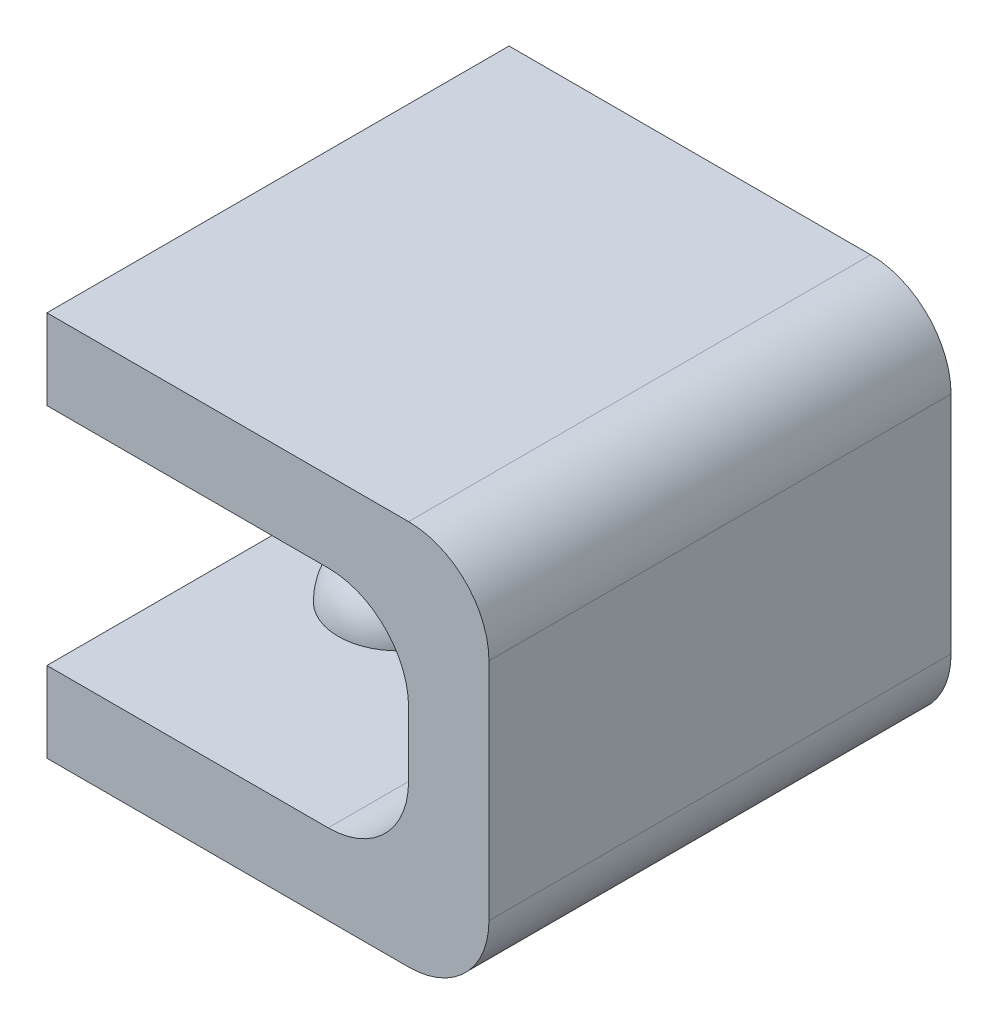
ISO-10303-21;
HEADER;
FILE_DESCRIPTION(('STEP AP214'),'2;1');
FILE_NAME('part.step','',(''),(''),'','','');
FILE_SCHEMA(('AUTOMOTIVE_DESIGN { 1 0 10303 214 1 1 1 1 }'));
ENDSEC;
DATA;
#1=APPLICATION_CONTEXT('core data for automotive mechanical design processes');
#2=APPLICATION_PROTOCOL_DEFINITION('international standard','automotive_design',2000,#1);
#3=PRODUCT_CONTEXT('',#1,'mechanical');
#4=PRODUCT('Part','Part','',(#3));
#5=PRODUCT_RELATED_PRODUCT_CATEGORY('part','',(#4));
#6=PRODUCT_DEFINITION_FORMATION('','',#4);
#7=PRODUCT_DEFINITION_CONTEXT('part definition',#1,'design');
#8=PRODUCT_DEFINITION('design','',#6,#7);
#9=PRODUCT_DEFINITION_SHAPE('','',#8);
#10=(LENGTH_UNIT() NAMED_UNIT(*) SI_UNIT(.MILLI.,.METRE.));
#11=(NAMED_UNIT(*) PLANE_ANGLE_UNIT() SI_UNIT($,.RADIAN.));
#12=(NAMED_UNIT(*) SI_UNIT($,.STERADIAN.) SOLID_ANGLE_UNIT());
#13=UNCERTAINTY_MEASURE_WITH_UNIT(LENGTH_MEASURE(1.E-05),#10,'distance_accuracy_value','');
#14=(GEOMETRIC_REPRESENTATION_CONTEXT(3) GLOBAL_UNCERTAINTY_ASSIGNED_CONTEXT((#13)) GLOBAL_UNIT_ASSIGNED_CONTEXT((#10,
#11,#12)) REPRESENTATION_CONTEXT('',''));
#15=CARTESIAN_POINT('',(0.,0.,0.));
#16=DIRECTION('',(0.,0.,1.));
#17=DIRECTION('',(1.,0.,0.));
#18=AXIS2_PLACEMENT_3D('',#15,#16,#17);
#19=CARTESIAN_POINT('',(-9.,4.8,11.5));
#20=DIRECTION('',(1.,0.,0.));
#21=DIRECTION('',(0.,0.,-1.));
#22=AXIS2_PLACEMENT_3D('',#19,#20,#21);
#23=PLANE('',#22);
#24=DIRECTION('',(0.,-1.,0.));
#25=VECTOR('',#24,1.);
#26=CARTESIAN_POINT('',(-9.,4.8,0.));
#27=LINE('',#26,#25);
#28=CARTESIAN_POINT('',(-9.,4.8,0.));
#29=VERTEX_POINT('',#28);
#30=CARTESIAN_POINT('',(-9.,2.8,0.));
#31=VERTEX_POINT('',#30);
#32=EDGE_CURVE('E147',#29,#31,#27,.T.);
#33=ORIENTED_EDGE('',*,*,#32,.T.);
#34=DIRECTION('',(0.,0.,-1.));
#35=VECTOR('',#34,1.);
#36=CARTESIAN_POINT('',(-9.,2.8,11.5));
#37=LINE('',#36,#35);
#38=CARTESIAN_POINT('',(-9.,2.8,11.5));
#39=VERTEX_POINT('',#38);
#40=EDGE_CURVE('E128',#39,#31,#37,.T.);
#41=ORIENTED_EDGE('',*,*,#40,.F.);
#42=DIRECTION('',(0.,-1.,0.));
#43=VECTOR('',#42,1.);
#44=CARTESIAN_POINT('',(-9.,4.8,11.5));
#45=LINE('',#44,#43);
#46=CARTESIAN_POINT('',(-9.,4.8,11.5));
#47=VERTEX_POINT('',#46);
#48=EDGE_CURVE('E134',#47,#39,#45,.T.);
#49=ORIENTED_EDGE('',*,*,#48,.F.);
#50=DIRECTION('',(0.,0.,-1.));
#51=VECTOR('',#50,1.);
#52=CARTESIAN_POINT('',(-9.,4.8,11.5));
#53=LINE('',#52,#51);
#54=EDGE_CURVE('E223',#47,#29,#53,.T.);
#55=ORIENTED_EDGE('',*,*,#54,.T.);
#56=EDGE_LOOP('',(#33,#41,#49,#55));
#57=FACE_BOUND('',#56,.T.);
#58=ADVANCED_FACE('F33',(#57),#23,.F.);
#59=CARTESIAN_POINT('',(-9.,2.8,11.5));
#60=DIRECTION('',(0.,1.,0.));
#61=DIRECTION('',(-1.,0.,0.));
#62=AXIS2_PLACEMENT_3D('',#59,#60,#61);
#63=PLANE('',#62);
#64=CARTESIAN_POINT('',(-6.,2.8,5.75));
#65=DIRECTION('',(0.,1.,0.));
#66=DIRECTION('',(-1.,0.,0.));
#67=AXIS2_PLACEMENT_3D('',#64,#65,#66);
#68=CIRCLE('',#67,1.5);
#69=CARTESIAN_POINT('',(-7.5,2.8,5.75));
#70=VERTEX_POINT('',#69);
#71=EDGE_CURVE('E148',#70,#70,#68,.F.);
#72=ORIENTED_EDGE('',*,*,#71,.F.);
#73=EDGE_LOOP('',(#72));
#74=FACE_BOUND('',#73,.T.);
#75=DIRECTION('',(1.,0.,0.));
#76=VECTOR('',#75,1.);
#77=CARTESIAN_POINT('',(-9.,2.8,0.));
#78=LINE('',#77,#76);
#79=CARTESIAN_POINT('',(-2.,2.8,0.));
#80=VERTEX_POINT('',#79);
#81=EDGE_CURVE('E206',#31,#80,#78,.T.);
#82=ORIENTED_EDGE('',*,*,#81,.T.);
#83=DIRECTION('',(0.,0.,-1.));
#84=VECTOR('',#83,1.);
#85=CARTESIAN_POINT('',(-2.,2.8,11.5));
#86=LINE('',#85,#84);
#87=CARTESIAN_POINT('',(-2.,2.8,11.5));
#88=VERTEX_POINT('',#87);
#89=EDGE_CURVE('E131',#80,#88,#86,.F.);
#90=ORIENTED_EDGE('',*,*,#89,.T.);
#91=DIRECTION('',(1.,0.,0.));
#92=VECTOR('',#91,1.);
#93=CARTESIAN_POINT('',(-9.,2.8,11.5));
#94=LINE('',#93,#92);
#95=EDGE_CURVE('E123',#39,#88,#94,.T.);
#96=ORIENTED_EDGE('',*,*,#95,.F.);
#97=ORIENTED_EDGE('',*,*,#40,.T.);
#98=EDGE_LOOP('',(#82,#90,#96,#97));
#99=FACE_BOUND('',#98,.T.);
#100=ADVANCED_FACE('F126',(#74,#99),#63,.F.);
#101=CARTESIAN_POINT('',(0.,2.8,11.5));
#102=DIRECTION('',(1.,0.,0.));
#103=DIRECTION('',(0.,0.,-1.));
#104=AXIS2_PLACEMENT_3D('',#101,#102,#103);
#105=PLANE('',#104);
#106=DIRECTION('',(0.,-1.,0.));
#107=VECTOR('',#106,1.);
#108=CARTESIAN_POINT('',(0.,2.8,11.5));
#109=LINE('',#108,#107);
#110=CARTESIAN_POINT('',(0.,0.8,11.5));
#111=VERTEX_POINT('',#110);
#112=CARTESIAN_POINT('',(0.,-0.8,11.5));
#113=VERTEX_POINT('',#112);
#114=EDGE_CURVE('E133',#111,#113,#109,.T.);
#115=ORIENTED_EDGE('',*,*,#114,.F.);
#116=DIRECTION('',(0.,0.,-1.));
#117=VECTOR('',#116,1.);
#118=CARTESIAN_POINT('',(0.,0.8,0.));
#119=LINE('',#118,#117);
#120=CARTESIAN_POINT('',(0.,0.8,0.));
#121=VERTEX_POINT('',#120);
#122=EDGE_CURVE('E180',#111,#121,#119,.T.);
#123=ORIENTED_EDGE('',*,*,#122,.T.);
#124=DIRECTION('',(0.,-1.,0.));
#125=VECTOR('',#124,1.);
#126=CARTESIAN_POINT('',(0.,2.8,0.));
#127=LINE('',#126,#125);
#128=CARTESIAN_POINT('',(0.,-0.8,0.));
#129=VERTEX_POINT('',#128);
#130=EDGE_CURVE('E196',#121,#129,#127,.T.);
#131=ORIENTED_EDGE('',*,*,#130,.T.);
#132=DIRECTION('',(0.,0.,-1.));
#133=VECTOR('',#132,1.);
#134=CARTESIAN_POINT('',(0.,-0.800000000000001,11.5));
#135=LINE('',#134,#133);
#136=EDGE_CURVE('E178',#129,#113,#135,.F.);
#137=ORIENTED_EDGE('',*,*,#136,.T.);
#138=EDGE_LOOP('',(#115,#123,#131,#137));
#139=FACE_BOUND('',#138,.T.);
#140=ADVANCED_FACE('F204',(#139),#105,.F.);
#141=CARTESIAN_POINT('',(0.,-2.8,11.5));
#142=DIRECTION('',(0.,-1.,0.));
#143=DIRECTION('',(1.,0.,0.));
#144=AXIS2_PLACEMENT_3D('',#141,#142,#143);
#145=PLANE('',#144);
#146=CARTESIAN_POINT('',(-6.,-2.8,5.75));
#147=DIRECTION('',(0.,-1.,0.));
#148=DIRECTION('',(1.,0.,0.));
#149=AXIS2_PLACEMENT_3D('',#146,#147,#148);
#150=CIRCLE('',#149,1.5);
#151=CARTESIAN_POINT('',(-4.5,-2.8,5.75));
#152=VERTEX_POINT('',#151);
#153=EDGE_CURVE('E152',#152,#152,#150,.F.);
#154=ORIENTED_EDGE('',*,*,#153,.F.);
#155=EDGE_LOOP('',(#154));
#156=FACE_BOUND('',#155,.T.);
#157=DIRECTION('',(-1.,0.,0.));
#158=VECTOR('',#157,1.);
#159=CARTESIAN_POINT('',(0.,-2.8,11.5));
#160=LINE('',#159,#158);
#161=CARTESIAN_POINT('',(-2.,-2.8,11.5));
#162=VERTEX_POINT('',#161);
#163=CARTESIAN_POINT('',(-9.,-2.8,11.5));
#164=VERTEX_POINT('',#163);
#165=EDGE_CURVE('E211',#162,#164,#160,.T.);
#166=ORIENTED_EDGE('',*,*,#165,.F.);
#167=DIRECTION('',(0.,0.,-1.));
#168=VECTOR('',#167,1.);
#169=CARTESIAN_POINT('',(-2.,-2.8,0.));
#170=LINE('',#169,#168);
#171=CARTESIAN_POINT('',(-2.,-2.8,0.));
#172=VERTEX_POINT('',#171);
#173=EDGE_CURVE('E184',#162,#172,#170,.T.);
#174=ORIENTED_EDGE('',*,*,#173,.T.);
#175=DIRECTION('',(-1.,0.,0.));
#176=VECTOR('',#175,1.);
#177=CARTESIAN_POINT('',(0.,-2.8,0.));
#178=LINE('',#177,#176);
#179=CARTESIAN_POINT('',(-9.,-2.8,0.));
#180=VERTEX_POINT('',#179);
#181=EDGE_CURVE('E198',#172,#180,#178,.T.);
#182=ORIENTED_EDGE('',*,*,#181,.T.);
#183=DIRECTION('',(0.,0.,-1.));
#184=VECTOR('',#183,1.);
#185=CARTESIAN_POINT('',(-9.,-2.8,11.5));
#186=LINE('',#185,#184);
#187=EDGE_CURVE('E149',#164,#180,#186,.T.);
#188=ORIENTED_EDGE('',*,*,#187,.F.);
#189=EDGE_LOOP('',(#166,#174,#182,#188));
#190=FACE_BOUND('',#189,.T.);
#191=ADVANCED_FACE('F209',(#156,#190),#145,.F.);
#192=CARTESIAN_POINT('',(-9.,-2.8,11.5));
#193=DIRECTION('',(1.,0.,0.));
#194=DIRECTION('',(0.,0.,-1.));
#195=AXIS2_PLACEMENT_3D('',#192,#193,#194);
#196=PLANE('',#195);
#197=DIRECTION('',(0.,-1.,0.));
#198=VECTOR('',#197,1.);
#199=CARTESIAN_POINT('',(-9.,-2.8,0.));
#200=LINE('',#199,#198);
#201=CARTESIAN_POINT('',(-9.,-4.8,0.));
#202=VERTEX_POINT('',#201);
#203=EDGE_CURVE('E227',#180,#202,#200,.T.);
#204=ORIENTED_EDGE('',*,*,#203,.T.);
#205=DIRECTION('',(0.,0.,-1.));
#206=VECTOR('',#205,1.);
#207=CARTESIAN_POINT('',(-9.,-4.8,11.5));
#208=LINE('',#207,#206);
#209=CARTESIAN_POINT('',(-9.,-4.8,11.5));
#210=VERTEX_POINT('',#209);
#211=EDGE_CURVE('E155',#210,#202,#208,.T.);
#212=ORIENTED_EDGE('',*,*,#211,.F.);
#213=DIRECTION('',(0.,-1.,0.));
#214=VECTOR('',#213,1.);
#215=CARTESIAN_POINT('',(-9.,-2.8,11.5));
#216=LINE('',#215,#214);
#217=EDGE_CURVE('E213',#164,#210,#216,.T.);
#218=ORIENTED_EDGE('',*,*,#217,.F.);
#219=ORIENTED_EDGE('',*,*,#187,.T.);
#220=EDGE_LOOP('',(#204,#212,#218,#219));
#221=FACE_BOUND('',#220,.T.);
#222=ADVANCED_FACE('F296',(#221),#196,.F.);
#223=CARTESIAN_POINT('',(-9.,-4.8,11.5));
#224=DIRECTION('',(0.,1.,0.));
#225=DIRECTION('',(0.,0.,1.));
#226=AXIS2_PLACEMENT_3D('',#223,#224,#225);
#227=PLANE('',#226);
#228=DIRECTION('',(1.,0.,0.));
#229=VECTOR('',#228,1.);
#230=CARTESIAN_POINT('',(-9.,-4.8,0.));
#231=LINE('',#230,#229);
#232=CARTESIAN_POINT('',(0.,-4.8,0.));
#233=VERTEX_POINT('',#232);
#234=EDGE_CURVE('E229',#202,#233,#231,.T.);
#235=ORIENTED_EDGE('',*,*,#234,.T.);
#236=DIRECTION('',(0.,0.,-1.));
#237=VECTOR('',#236,1.);
#238=CARTESIAN_POINT('',(0.,-4.8,11.5));
#239=LINE('',#238,#237);
#240=CARTESIAN_POINT('',(0.,-4.8,11.5));
#241=VERTEX_POINT('',#240);
#242=EDGE_CURVE('E48',#233,#241,#239,.F.);
#243=ORIENTED_EDGE('',*,*,#242,.T.);
#244=DIRECTION('',(1.,0.,0.));
#245=VECTOR('',#244,1.);
#246=CARTESIAN_POINT('',(-9.,-4.8,11.5));
#247=LINE('',#246,#245);
#248=EDGE_CURVE('E215',#210,#241,#247,.T.);
#249=ORIENTED_EDGE('',*,*,#248,.F.);
#250=ORIENTED_EDGE('',*,*,#211,.T.);
#251=EDGE_LOOP('',(#235,#243,#249,#250));
#252=FACE_BOUND('',#251,.T.);
#253=ADVANCED_FACE('F238',(#252),#227,.F.);
#254=CARTESIAN_POINT('',(2.,-4.8,11.5));
#255=DIRECTION('',(-1.,0.,0.));
#256=DIRECTION('',(0.,-1.,0.));
#257=AXIS2_PLACEMENT_3D('',#254,#255,#256);
#258=PLANE('',#257);
#259=DIRECTION('',(0.,1.,0.));
#260=VECTOR('',#259,1.);
#261=CARTESIAN_POINT('',(2.,-4.8,0.));
#262=LINE('',#261,#260);
#263=CARTESIAN_POINT('',(2.,-2.8,0.));
#264=VERTEX_POINT('',#263);
#265=CARTESIAN_POINT('',(2.,2.8,0.));
#266=VERTEX_POINT('',#265);
#267=EDGE_CURVE('E231',#264,#266,#262,.T.);
#268=ORIENTED_EDGE('',*,*,#267,.T.);
#269=DIRECTION('',(0.,0.,-1.));
#270=VECTOR('',#269,1.);
#271=CARTESIAN_POINT('',(2.,2.8,11.5));
#272=LINE('',#271,#270);
#273=CARTESIAN_POINT('',(2.,2.8,11.5));
#274=VERTEX_POINT('',#273);
#275=EDGE_CURVE('E171',#266,#274,#272,.F.);
#276=ORIENTED_EDGE('',*,*,#275,.T.);
#277=DIRECTION('',(0.,1.,0.));
#278=VECTOR('',#277,1.);
#279=CARTESIAN_POINT('',(2.,-4.8,11.5));
#280=LINE('',#279,#278);
#281=CARTESIAN_POINT('',(2.,-2.8,11.5));
#282=VERTEX_POINT('',#281);
#283=EDGE_CURVE('E220',#282,#274,#280,.T.);
#284=ORIENTED_EDGE('',*,*,#283,.F.);
#285=DIRECTION('',(0.,0.,-1.));
#286=VECTOR('',#285,1.);
#287=CARTESIAN_POINT('',(2.,-2.8,11.5));
#288=LINE('',#287,#286);
#289=EDGE_CURVE('E168',#282,#264,#288,.T.);
#290=ORIENTED_EDGE('',*,*,#289,.T.);
#291=EDGE_LOOP('',(#268,#276,#284,#290));
#292=FACE_BOUND('',#291,.T.);
#293=ADVANCED_FACE('F247',(#292),#258,.F.);
#294=CARTESIAN_POINT('',(2.,4.8,11.5));
#295=DIRECTION('',(0.,-1.,0.));
#296=DIRECTION('',(1.,0.,0.));
#297=AXIS2_PLACEMENT_3D('',#294,#295,#296);
#298=PLANE('',#297);
#299=DIRECTION('',(-1.,0.,0.));
#300=VECTOR('',#299,1.);
#301=CARTESIAN_POINT('',(2.,4.8,11.5));
#302=LINE('',#301,#300);
#303=CARTESIAN_POINT('',(0.,4.8,11.5));
#304=VERTEX_POINT('',#303);
#305=EDGE_CURVE('E140',#304,#47,#302,.T.);
#306=ORIENTED_EDGE('',*,*,#305,.F.);
#307=DIRECTION('',(0.,0.,-1.));
#308=VECTOR('',#307,1.);
#309=CARTESIAN_POINT('',(0.,4.8,11.5));
#310=LINE('',#309,#308);
#311=CARTESIAN_POINT('',(0.,4.8,0.));
#312=VERTEX_POINT('',#311);
#313=EDGE_CURVE('E161',#304,#312,#310,.T.);
#314=ORIENTED_EDGE('',*,*,#313,.T.);
#315=DIRECTION('',(-1.,0.,0.));
#316=VECTOR('',#315,1.);
#317=CARTESIAN_POINT('',(2.,4.8,0.));
#318=LINE('',#317,#316);
#319=EDGE_CURVE('E144',#312,#29,#318,.T.);
#320=ORIENTED_EDGE('',*,*,#319,.T.);
#321=ORIENTED_EDGE('',*,*,#54,.F.);
#322=EDGE_LOOP('',(#306,#314,#320,#321));
#323=FACE_BOUND('',#322,.T.);
#324=ADVANCED_FACE('F254',(#323),#298,.F.);
#325=CARTESIAN_POINT('',(0.,0.,11.5));
#326=DIRECTION('',(0.,0.,1.));
#327=DIRECTION('',(1.,0.,0.));
#328=AXIS2_PLACEMENT_3D('',#325,#326,#327);
#329=PLANE('',#328);
#330=ORIENTED_EDGE('',*,*,#283,.T.);
#331=CARTESIAN_POINT('',(0.,2.8,11.5));
#332=DIRECTION('',(0.,0.,1.));
#333=DIRECTION('',(1.,0.,0.));
#334=AXIS2_PLACEMENT_3D('',#331,#332,#333);
#335=CIRCLE('',#334,2.);
#336=EDGE_CURVE('E175',#274,#304,#335,.T.);
#337=ORIENTED_EDGE('',*,*,#336,.T.);
#338=ORIENTED_EDGE('',*,*,#305,.T.);
#339=ORIENTED_EDGE('',*,*,#48,.T.);
#340=ORIENTED_EDGE('',*,*,#95,.T.);
#341=CARTESIAN_POINT('',(-2.,0.8,11.5));
#342=DIRECTION('',(0.,0.,1.));
#343=DIRECTION('',(1.,0.,0.));
#344=AXIS2_PLACEMENT_3D('',#341,#342,#343);
#345=CIRCLE('',#344,2.);
#346=EDGE_CURVE('E189',#88,#111,#345,.F.);
#347=ORIENTED_EDGE('',*,*,#346,.T.);
#348=ORIENTED_EDGE('',*,*,#114,.T.);
#349=CARTESIAN_POINT('',(-2.,-0.800000000000001,11.5));
#350=DIRECTION('',(0.,0.,1.));
#351=DIRECTION('',(1.,0.,0.));
#352=AXIS2_PLACEMENT_3D('',#349,#350,#351);
#353=CIRCLE('',#352,2.);
#354=EDGE_CURVE('E11',#113,#162,#353,.F.);
#355=ORIENTED_EDGE('',*,*,#354,.T.);
#356=ORIENTED_EDGE('',*,*,#165,.T.);
#357=ORIENTED_EDGE('',*,*,#217,.T.);
#358=ORIENTED_EDGE('',*,*,#248,.T.);
#359=CARTESIAN_POINT('',(0.,-2.8,11.5));
#360=DIRECTION('',(0.,0.,1.));
#361=DIRECTION('',(1.,0.,0.));
#362=AXIS2_PLACEMENT_3D('',#359,#360,#361);
#363=CIRCLE('',#362,2.);
#364=EDGE_CURVE('E173',#241,#282,#363,.T.);
#365=ORIENTED_EDGE('',*,*,#364,.T.);
#366=EDGE_LOOP('',(#330,#337,#338,#339,#340,#347,#348,#355,#356,#357,#358,#365));
#367=FACE_BOUND('',#366,.T.);
#368=ADVANCED_FACE('F138',(#367),#329,.T.);
#369=CARTESIAN_POINT('',(0.,0.,0.));
#370=DIRECTION('',(0.,0.,1.));
#371=DIRECTION('',(1.,0.,0.));
#372=AXIS2_PLACEMENT_3D('',#369,#370,#371);
#373=PLANE('',#372);
#374=ORIENTED_EDGE('',*,*,#319,.F.);
#375=CARTESIAN_POINT('',(0.,2.8,0.));
#376=DIRECTION('',(0.,0.,1.));
#377=DIRECTION('',(1.,0.,0.));
#378=AXIS2_PLACEMENT_3D('',#375,#376,#377);
#379=CIRCLE('',#378,2.);
#380=EDGE_CURVE('E166',#312,#266,#379,.F.);
#381=ORIENTED_EDGE('',*,*,#380,.T.);
#382=ORIENTED_EDGE('',*,*,#267,.F.);
#383=CARTESIAN_POINT('',(0.,-2.8,0.));
#384=DIRECTION('',(0.,0.,1.));
#385=DIRECTION('',(1.,0.,0.));
#386=AXIS2_PLACEMENT_3D('',#383,#384,#385);
#387=CIRCLE('',#386,2.);
#388=EDGE_CURVE('E164',#264,#233,#387,.F.);
#389=ORIENTED_EDGE('',*,*,#388,.T.);
#390=ORIENTED_EDGE('',*,*,#234,.F.);
#391=ORIENTED_EDGE('',*,*,#203,.F.);
#392=ORIENTED_EDGE('',*,*,#181,.F.);
#393=CARTESIAN_POINT('',(-2.,-0.800000000000001,0.));
#394=DIRECTION('',(0.,0.,1.));
#395=DIRECTION('',(1.,0.,0.));
#396=AXIS2_PLACEMENT_3D('',#393,#394,#395);
#397=CIRCLE('',#396,2.);
#398=EDGE_CURVE('E41',#172,#129,#397,.T.);
#399=ORIENTED_EDGE('',*,*,#398,.T.);
#400=ORIENTED_EDGE('',*,*,#130,.F.);
#401=CARTESIAN_POINT('',(-2.,0.8,0.));
#402=DIRECTION('',(0.,0.,1.));
#403=DIRECTION('',(1.,0.,0.));
#404=AXIS2_PLACEMENT_3D('',#401,#402,#403);
#405=CIRCLE('',#404,2.);
#406=EDGE_CURVE('E187',#121,#80,#405,.T.);
#407=ORIENTED_EDGE('',*,*,#406,.T.);
#408=ORIENTED_EDGE('',*,*,#81,.F.);
#409=ORIENTED_EDGE('',*,*,#32,.F.);
#410=EDGE_LOOP('',(#374,#381,#382,#389,#390,#391,#392,#399,#400,#407,#408,#409));
#411=FACE_BOUND('',#410,.T.);
#412=ADVANCED_FACE('F195',(#411),#373,.F.);
#413=CARTESIAN_POINT('',(-6.,2.8,5.75));
#414=DIRECTION('',(0.,0.,-1.));
#415=DIRECTION('',(1.,0.,0.));
#416=AXIS2_PLACEMENT_3D('',#413,#414,#415);
#417=SPHERICAL_SURFACE('',#416,1.5);
#418=CARTESIAN_POINT('',(-6.,2.8,5.75));
#419=DIRECTION('',(0.,1.,0.));
#420=DIRECTION('',(-1.,0.,0.));
#421=AXIS2_PLACEMENT_3D('',#418,#419,#420);
#422=SPHERICAL_SURFACE('',#421,1.5);
#423=ORIENTED_EDGE('',*,*,#71,.T.);
#424=EDGE_LOOP('',(#423));
#425=FACE_BOUND('',#424,.T.);
#426=ADVANCED_FACE('F277',(#425),#422,.T.);
#427=CARTESIAN_POINT('',(-6.,-2.8,5.75));
#428=DIRECTION('',(0.,0.,-1.));
#429=DIRECTION('',(1.,0.,0.));
#430=AXIS2_PLACEMENT_3D('',#427,#428,#429);
#431=SPHERICAL_SURFACE('',#430,1.5);
#432=CARTESIAN_POINT('',(-6.,-2.8,5.75));
#433=DIRECTION('',(0.,-1.,0.));
#434=DIRECTION('',(1.,0.,0.));
#435=AXIS2_PLACEMENT_3D('',#432,#433,#434);
#436=SPHERICAL_SURFACE('',#435,1.5);
#437=ORIENTED_EDGE('',*,*,#153,.T.);
#438=EDGE_LOOP('',(#437));
#439=FACE_BOUND('',#438,.T.);
#440=ADVANCED_FACE('F273',(#439),#436,.T.);
#441=CARTESIAN_POINT('',(0.,2.8,11.5));
#442=DIRECTION('',(0.,0.,-1.));
#443=DIRECTION('',(-1.,0.,0.));
#444=AXIS2_PLACEMENT_3D('',#441,#442,#443);
#445=CYLINDRICAL_SURFACE('',#444,2.);
#446=ORIENTED_EDGE('',*,*,#336,.F.);
#447=ORIENTED_EDGE('',*,*,#275,.F.);
#448=ORIENTED_EDGE('',*,*,#380,.F.);
#449=ORIENTED_EDGE('',*,*,#313,.F.);
#450=EDGE_LOOP('',(#446,#447,#448,#449));
#451=FACE_BOUND('',#450,.T.);
#452=ADVANCED_FACE('F252',(#451),#445,.T.);
#453=CARTESIAN_POINT('',(0.,-2.8,11.5));
#454=DIRECTION('',(0.,0.,-1.));
#455=DIRECTION('',(-1.,0.,0.));
#456=AXIS2_PLACEMENT_3D('',#453,#454,#455);
#457=CYLINDRICAL_SURFACE('',#456,2.);
#458=ORIENTED_EDGE('',*,*,#364,.F.);
#459=ORIENTED_EDGE('',*,*,#242,.F.);
#460=ORIENTED_EDGE('',*,*,#388,.F.);
#461=ORIENTED_EDGE('',*,*,#289,.F.);
#462=EDGE_LOOP('',(#458,#459,#460,#461));
#463=FACE_BOUND('',#462,.T.);
#464=ADVANCED_FACE('F244',(#463),#457,.T.);
#465=CARTESIAN_POINT('',(-2.,0.8,11.5));
#466=DIRECTION('',(0.,0.,1.));
#467=DIRECTION('',(1.,0.,0.));
#468=AXIS2_PLACEMENT_3D('',#465,#466,#467);
#469=CYLINDRICAL_SURFACE('',#468,2.);
#470=ORIENTED_EDGE('',*,*,#346,.F.);
#471=ORIENTED_EDGE('',*,*,#89,.F.);
#472=ORIENTED_EDGE('',*,*,#406,.F.);
#473=ORIENTED_EDGE('',*,*,#122,.F.);
#474=EDGE_LOOP('',(#470,#471,#472,#473));
#475=FACE_BOUND('',#474,.T.);
#476=ADVANCED_FACE('F256',(#475),#469,.F.);
#477=CARTESIAN_POINT('',(-2.,-0.800000000000001,11.5));
#478=DIRECTION('',(0.,0.,1.));
#479=DIRECTION('',(1.,0.,0.));
#480=AXIS2_PLACEMENT_3D('',#477,#478,#479);
#481=CYLINDRICAL_SURFACE('',#480,2.);
#482=ORIENTED_EDGE('',*,*,#354,.F.);
#483=ORIENTED_EDGE('',*,*,#136,.F.);
#484=ORIENTED_EDGE('',*,*,#398,.F.);
#485=ORIENTED_EDGE('',*,*,#173,.F.);
#486=EDGE_LOOP('',(#482,#483,#484,#485));
#487=FACE_BOUND('',#486,.T.);
#488=ADVANCED_FACE('F35',(#487),#481,.F.);
#489=CLOSED_SHELL('',(#58,#100,#140,#191,#222,#253,#293,#324,#368,#412,#426,#440,#452,#464,#476,#488));
#490=MANIFOLD_SOLID_BREP('B2',#489);
#491=ADVANCED_BREP_SHAPE_REPRESENTATION('',(#18,#490),#14);
#492=SHAPE_DEFINITION_REPRESENTATION(#9,#491);
ENDSEC;
END-ISO-10303-21;
